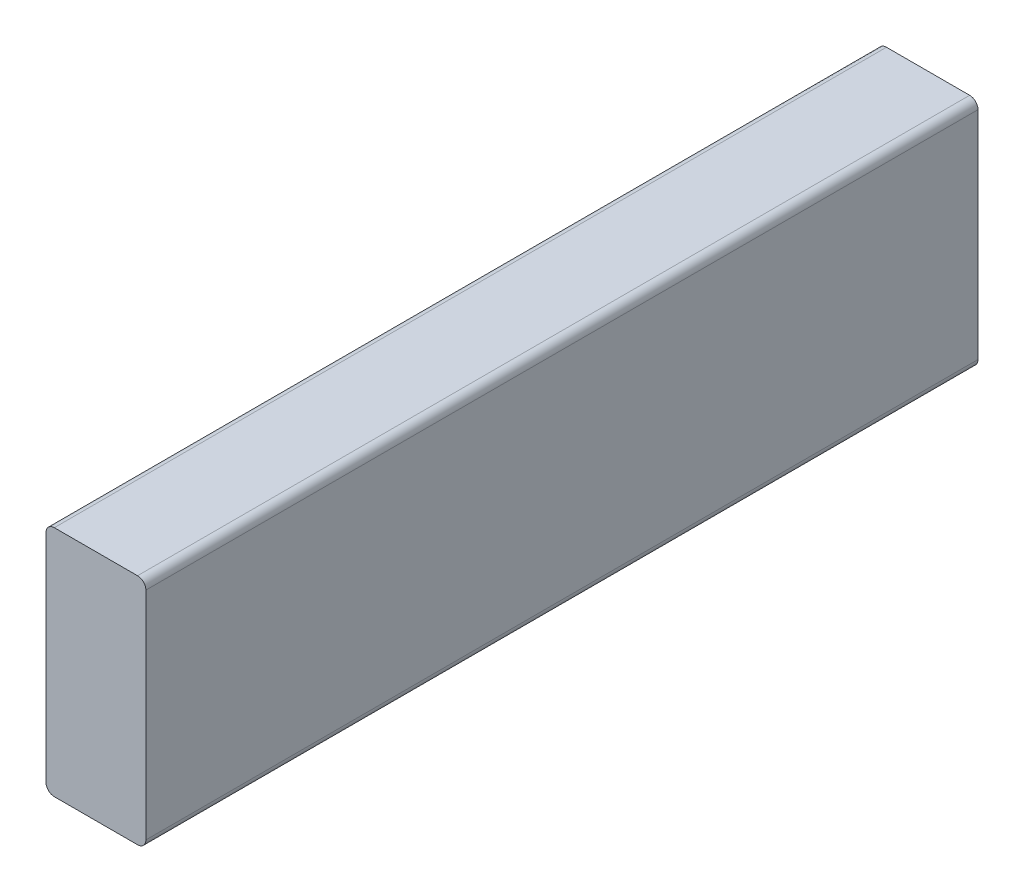
ISO-10303-21;
HEADER;
FILE_DESCRIPTION(('STEP AP214'),'2;1');
FILE_NAME('part.step','',(''),(''),'','','');
FILE_SCHEMA(('AUTOMOTIVE_DESIGN { 1 0 10303 214 1 1 1 1 }'));
ENDSEC;
DATA;
#1=APPLICATION_CONTEXT('core data for automotive mechanical design processes');
#2=APPLICATION_PROTOCOL_DEFINITION('international standard','automotive_design',2000,#1);
#3=PRODUCT_CONTEXT('',#1,'mechanical');
#4=PRODUCT('Part','Part','',(#3));
#5=PRODUCT_RELATED_PRODUCT_CATEGORY('part','',(#4));
#6=PRODUCT_DEFINITION_FORMATION('','',#4);
#7=PRODUCT_DEFINITION_CONTEXT('part definition',#1,'design');
#8=PRODUCT_DEFINITION('design','',#6,#7);
#9=PRODUCT_DEFINITION_SHAPE('','',#8);
#10=(LENGTH_UNIT() NAMED_UNIT(*) SI_UNIT(.MILLI.,.METRE.));
#11=(NAMED_UNIT(*) PLANE_ANGLE_UNIT() SI_UNIT($,.RADIAN.));
#12=(NAMED_UNIT(*) SI_UNIT($,.STERADIAN.) SOLID_ANGLE_UNIT());
#13=UNCERTAINTY_MEASURE_WITH_UNIT(LENGTH_MEASURE(1.E-05),#10,'distance_accuracy_value','');
#14=(GEOMETRIC_REPRESENTATION_CONTEXT(3) GLOBAL_UNCERTAINTY_ASSIGNED_CONTEXT((#13)) GLOBAL_UNIT_ASSIGNED_CONTEXT((#10,
#11,#12)) REPRESENTATION_CONTEXT('',''));
#15=CARTESIAN_POINT('',(0.,0.,0.));
#16=DIRECTION('',(0.,0.,1.));
#17=DIRECTION('',(1.,0.,0.));
#18=AXIS2_PLACEMENT_3D('',#15,#16,#17);
#19=CARTESIAN_POINT('',(19.05,88.9,158.75));
#20=DIRECTION('',(0.,0.,-1.));
#21=DIRECTION('',(-1.,0.,0.));
#22=AXIS2_PLACEMENT_3D('',#19,#20,#21);
#23=PLANE('',#22);
#24=DIRECTION('',(0.,-1.,0.));
#25=VECTOR('',#24,1.);
#26=CARTESIAN_POINT('',(-19.05,88.9,158.75));
#27=LINE('',#26,#25);
#28=CARTESIAN_POINT('',(-19.05,85.725,158.75));
#29=VERTEX_POINT('',#28);
#30=CARTESIAN_POINT('',(-19.05,3.175,158.75));
#31=VERTEX_POINT('',#30);
#32=EDGE_CURVE('E168',#29,#31,#27,.T.);
#33=ORIENTED_EDGE('',*,*,#32,.T.);
#34=CARTESIAN_POINT('',(-15.875,3.175,158.75));
#35=DIRECTION('',(0.,0.,-1.));
#36=DIRECTION('',(-1.,0.,0.));
#37=AXIS2_PLACEMENT_3D('',#34,#35,#36);
#38=CIRCLE('',#37,3.175);
#39=CARTESIAN_POINT('',(-15.875,0.,158.75));
#40=VERTEX_POINT('',#39);
#41=EDGE_CURVE('E142',#31,#40,#38,.F.);
#42=ORIENTED_EDGE('',*,*,#41,.T.);
#43=DIRECTION('',(-1.,0.,0.));
#44=VECTOR('',#43,1.);
#45=CARTESIAN_POINT('',(19.05,0.,158.75));
#46=LINE('',#45,#44);
#47=CARTESIAN_POINT('',(15.875,0.,158.75));
#48=VERTEX_POINT('',#47);
#49=EDGE_CURVE('E121',#48,#40,#46,.T.);
#50=ORIENTED_EDGE('',*,*,#49,.F.);
#51=CARTESIAN_POINT('',(15.875,3.175,158.75));
#52=DIRECTION('',(0.,0.,-1.));
#53=DIRECTION('',(-1.,0.,0.));
#54=AXIS2_PLACEMENT_3D('',#51,#52,#53);
#55=CIRCLE('',#54,3.175);
#56=CARTESIAN_POINT('',(19.05,3.175,158.75));
#57=VERTEX_POINT('',#56);
#58=EDGE_CURVE('E126',#48,#57,#55,.F.);
#59=ORIENTED_EDGE('',*,*,#58,.T.);
#60=DIRECTION('',(0.,-1.,0.));
#61=VECTOR('',#60,1.);
#62=CARTESIAN_POINT('',(19.05,88.9,158.75));
#63=LINE('',#62,#61);
#64=CARTESIAN_POINT('',(19.05,85.725,158.75));
#65=VERTEX_POINT('',#64);
#66=EDGE_CURVE('E163',#65,#57,#63,.T.);
#67=ORIENTED_EDGE('',*,*,#66,.F.);
#68=CARTESIAN_POINT('',(15.875,85.725,158.75));
#69=DIRECTION('',(0.,0.,-1.));
#70=DIRECTION('',(-1.,0.,0.));
#71=AXIS2_PLACEMENT_3D('',#68,#69,#70);
#72=CIRCLE('',#71,3.175);
#73=CARTESIAN_POINT('',(15.875,88.9,158.75));
#74=VERTEX_POINT('',#73);
#75=EDGE_CURVE('E56',#65,#74,#72,.F.);
#76=ORIENTED_EDGE('',*,*,#75,.T.);
#77=DIRECTION('',(-1.,0.,0.));
#78=VECTOR('',#77,1.);
#79=CARTESIAN_POINT('',(19.05,88.9,158.75));
#80=LINE('',#79,#78);
#81=CARTESIAN_POINT('',(-15.875,88.9,158.75));
#82=VERTEX_POINT('',#81);
#83=EDGE_CURVE('E153',#74,#82,#80,.T.);
#84=ORIENTED_EDGE('',*,*,#83,.T.);
#85=CARTESIAN_POINT('',(-15.875,85.725,158.75));
#86=DIRECTION('',(0.,0.,-1.));
#87=DIRECTION('',(-1.,0.,0.));
#88=AXIS2_PLACEMENT_3D('',#85,#86,#87);
#89=CIRCLE('',#88,3.175);
#90=EDGE_CURVE('E49',#82,#29,#89,.F.);
#91=ORIENTED_EDGE('',*,*,#90,.T.);
#92=EDGE_LOOP('',(#33,#42,#50,#59,#67,#76,#84,#91));
#93=FACE_BOUND('',#92,.T.);
#94=ADVANCED_FACE('F34',(#93),#23,.F.);
#95=CARTESIAN_POINT('',(19.05,0.,158.75));
#96=DIRECTION('',(0.,1.,0.));
#97=DIRECTION('',(0.,0.,1.));
#98=AXIS2_PLACEMENT_3D('',#95,#96,#97);
#99=PLANE('',#98);
#100=ORIENTED_EDGE('',*,*,#49,.T.);
#101=DIRECTION('',(0.,0.,-1.));
#102=VECTOR('',#101,1.);
#103=CARTESIAN_POINT('',(-15.875,0.,158.75));
#104=LINE('',#103,#102);
#105=CARTESIAN_POINT('',(-15.875,0.,-158.75));
#106=VERTEX_POINT('',#105);
#107=EDGE_CURVE('E120',#40,#106,#104,.T.);
#108=ORIENTED_EDGE('',*,*,#107,.T.);
#109=DIRECTION('',(-1.,0.,0.));
#110=VECTOR('',#109,1.);
#111=CARTESIAN_POINT('',(19.05,0.,-158.75));
#112=LINE('',#111,#110);
#113=CARTESIAN_POINT('',(15.875,0.,-158.75));
#114=VERTEX_POINT('',#113);
#115=EDGE_CURVE('E103',#114,#106,#112,.T.);
#116=ORIENTED_EDGE('',*,*,#115,.F.);
#117=DIRECTION('',(0.,0.,-1.));
#118=VECTOR('',#117,1.);
#119=CARTESIAN_POINT('',(15.875,0.,158.75));
#120=LINE('',#119,#118);
#121=EDGE_CURVE('E117',#114,#48,#120,.F.);
#122=ORIENTED_EDGE('',*,*,#121,.T.);
#123=EDGE_LOOP('',(#100,#108,#116,#122));
#124=FACE_BOUND('',#123,.T.);
#125=ADVANCED_FACE('F116',(#124),#99,.F.);
#126=CARTESIAN_POINT('',(19.05,88.9,-158.75));
#127=DIRECTION('',(0.,0.,1.));
#128=DIRECTION('',(0.,-1.,0.));
#129=AXIS2_PLACEMENT_3D('',#126,#127,#128);
#130=PLANE('',#129);
#131=ORIENTED_EDGE('',*,*,#115,.T.);
#132=CARTESIAN_POINT('',(-15.875,3.17500000000006,-158.75));
#133=DIRECTION('',(0.,0.,1.));
#134=DIRECTION('',(0.,-1.,0.));
#135=AXIS2_PLACEMENT_3D('',#132,#133,#134);
#136=CIRCLE('',#135,3.175);
#137=CARTESIAN_POINT('',(-19.05,3.17500000000005,-158.75));
#138=VERTEX_POINT('',#137);
#139=EDGE_CURVE('E110',#106,#138,#136,.F.);
#140=ORIENTED_EDGE('',*,*,#139,.T.);
#141=DIRECTION('',(0.,1.,0.));
#142=VECTOR('',#141,1.);
#143=CARTESIAN_POINT('',(-19.05,88.9,-158.75));
#144=LINE('',#143,#142);
#145=CARTESIAN_POINT('',(-19.05,85.7250000000001,-158.75));
#146=VERTEX_POINT('',#145);
#147=EDGE_CURVE('E165',#138,#146,#144,.T.);
#148=ORIENTED_EDGE('',*,*,#147,.T.);
#149=CARTESIAN_POINT('',(-15.875,85.7250000000001,-158.75));
#150=DIRECTION('',(0.,0.,1.));
#151=DIRECTION('',(0.,-1.,0.));
#152=AXIS2_PLACEMENT_3D('',#149,#150,#151);
#153=CIRCLE('',#152,3.175);
#154=CARTESIAN_POINT('',(-15.875,88.9,-158.75));
#155=VERTEX_POINT('',#154);
#156=EDGE_CURVE('E111',#146,#155,#153,.F.);
#157=ORIENTED_EDGE('',*,*,#156,.T.);
#158=DIRECTION('',(-1.,0.,0.));
#159=VECTOR('',#158,1.);
#160=CARTESIAN_POINT('',(19.05,88.9,-158.75));
#161=LINE('',#160,#159);
#162=CARTESIAN_POINT('',(15.875,88.9,-158.75));
#163=VERTEX_POINT('',#162);
#164=EDGE_CURVE('E122',#163,#155,#161,.T.);
#165=ORIENTED_EDGE('',*,*,#164,.F.);
#166=CARTESIAN_POINT('',(15.875,85.7250000000001,-158.75));
#167=DIRECTION('',(0.,0.,1.));
#168=DIRECTION('',(0.,-1.,0.));
#169=AXIS2_PLACEMENT_3D('',#166,#167,#168);
#170=CIRCLE('',#169,3.175);
#171=CARTESIAN_POINT('',(19.05,85.7250000000001,-158.75));
#172=VERTEX_POINT('',#171);
#173=EDGE_CURVE('E128',#163,#172,#170,.F.);
#174=ORIENTED_EDGE('',*,*,#173,.T.);
#175=DIRECTION('',(0.,1.,0.));
#176=VECTOR('',#175,1.);
#177=CARTESIAN_POINT('',(19.05,88.9,-158.75));
#178=LINE('',#177,#176);
#179=CARTESIAN_POINT('',(19.05,3.17500000000005,-158.75));
#180=VERTEX_POINT('',#179);
#181=EDGE_CURVE('E105',#180,#172,#178,.T.);
#182=ORIENTED_EDGE('',*,*,#181,.F.);
#183=CARTESIAN_POINT('',(15.875,3.17500000000006,-158.75));
#184=DIRECTION('',(0.,0.,1.));
#185=DIRECTION('',(0.,-1.,0.));
#186=AXIS2_PLACEMENT_3D('',#183,#184,#185);
#187=CIRCLE('',#186,3.175);
#188=EDGE_CURVE('E100',#180,#114,#187,.F.);
#189=ORIENTED_EDGE('',*,*,#188,.T.);
#190=EDGE_LOOP('',(#131,#140,#148,#157,#165,#174,#182,#189));
#191=FACE_BOUND('',#190,.T.);
#192=ADVANCED_FACE('F102',(#191),#130,.F.);
#193=CARTESIAN_POINT('',(19.05,88.9,158.75));
#194=DIRECTION('',(0.,-1.,0.));
#195=DIRECTION('',(0.,0.,-1.));
#196=AXIS2_PLACEMENT_3D('',#193,#194,#195);
#197=PLANE('',#196);
#198=ORIENTED_EDGE('',*,*,#164,.T.);
#199=DIRECTION('',(0.,0.,1.));
#200=VECTOR('',#199,1.);
#201=CARTESIAN_POINT('',(-15.875,88.9,158.75));
#202=LINE('',#201,#200);
#203=EDGE_CURVE('E11',#155,#82,#202,.T.);
#204=ORIENTED_EDGE('',*,*,#203,.T.);
#205=ORIENTED_EDGE('',*,*,#83,.F.);
#206=DIRECTION('',(0.,0.,1.));
#207=VECTOR('',#206,1.);
#208=CARTESIAN_POINT('',(15.875,88.9,-158.75));
#209=LINE('',#208,#207);
#210=EDGE_CURVE('E42',#74,#163,#209,.F.);
#211=ORIENTED_EDGE('',*,*,#210,.T.);
#212=EDGE_LOOP('',(#198,#204,#205,#211));
#213=FACE_BOUND('',#212,.T.);
#214=ADVANCED_FACE('F152',(#213),#197,.F.);
#215=CARTESIAN_POINT('',(19.05,0.,0.));
#216=DIRECTION('',(1.,0.,0.));
#217=DIRECTION('',(0.,0.,-1.));
#218=AXIS2_PLACEMENT_3D('',#215,#216,#217);
#219=PLANE('',#218);
#220=ORIENTED_EDGE('',*,*,#66,.T.);
#221=DIRECTION('',(0.,0.,-1.));
#222=VECTOR('',#221,1.);
#223=CARTESIAN_POINT('',(19.05,3.17500000000006,-158.75));
#224=LINE('',#223,#222);
#225=EDGE_CURVE('E147',#57,#180,#224,.T.);
#226=ORIENTED_EDGE('',*,*,#225,.T.);
#227=ORIENTED_EDGE('',*,*,#181,.T.);
#228=DIRECTION('',(0.,0.,1.));
#229=VECTOR('',#228,1.);
#230=CARTESIAN_POINT('',(19.05,85.725,158.75));
#231=LINE('',#230,#229);
#232=EDGE_CURVE('E144',#172,#65,#231,.T.);
#233=ORIENTED_EDGE('',*,*,#232,.T.);
#234=EDGE_LOOP('',(#220,#226,#227,#233));
#235=FACE_BOUND('',#234,.T.);
#236=ADVANCED_FACE('F162',(#235),#219,.T.);
#237=CARTESIAN_POINT('',(-19.05,0.,0.));
#238=DIRECTION('',(1.,0.,0.));
#239=DIRECTION('',(0.,0.,-1.));
#240=AXIS2_PLACEMENT_3D('',#237,#238,#239);
#241=PLANE('',#240);
#242=ORIENTED_EDGE('',*,*,#147,.F.);
#243=DIRECTION('',(0.,0.,-1.));
#244=VECTOR('',#243,1.);
#245=CARTESIAN_POINT('',(-19.05,3.17500000000003,0.));
#246=LINE('',#245,#244);
#247=EDGE_CURVE('E137',#138,#31,#246,.F.);
#248=ORIENTED_EDGE('',*,*,#247,.T.);
#249=ORIENTED_EDGE('',*,*,#32,.F.);
#250=DIRECTION('',(0.,0.,1.));
#251=VECTOR('',#250,1.);
#252=CARTESIAN_POINT('',(-19.05,85.725,0.));
#253=LINE('',#252,#251);
#254=EDGE_CURVE('E135',#29,#146,#253,.F.);
#255=ORIENTED_EDGE('',*,*,#254,.T.);
#256=EDGE_LOOP('',(#242,#248,#249,#255));
#257=FACE_BOUND('',#256,.T.);
#258=ADVANCED_FACE('F176',(#257),#241,.F.);
#259=CARTESIAN_POINT('',(-15.875,3.175,158.75));
#260=DIRECTION('',(0.,0.,-1.));
#261=DIRECTION('',(0.,1.,0.));
#262=AXIS2_PLACEMENT_3D('',#259,#260,#261);
#263=CYLINDRICAL_SURFACE('',#262,3.175);
#264=ORIENTED_EDGE('',*,*,#41,.F.);
#265=ORIENTED_EDGE('',*,*,#247,.F.);
#266=ORIENTED_EDGE('',*,*,#139,.F.);
#267=ORIENTED_EDGE('',*,*,#107,.F.);
#268=EDGE_LOOP('',(#264,#265,#266,#267));
#269=FACE_BOUND('',#268,.T.);
#270=ADVANCED_FACE('F184',(#269),#263,.T.);
#271=CARTESIAN_POINT('',(15.875,3.17500000000003,0.));
#272=DIRECTION('',(0.,0.,1.));
#273=DIRECTION('',(0.,-1.,0.));
#274=AXIS2_PLACEMENT_3D('',#271,#272,#273);
#275=CYLINDRICAL_SURFACE('',#274,3.175);
#276=ORIENTED_EDGE('',*,*,#58,.F.);
#277=ORIENTED_EDGE('',*,*,#121,.F.);
#278=ORIENTED_EDGE('',*,*,#188,.F.);
#279=ORIENTED_EDGE('',*,*,#225,.F.);
#280=EDGE_LOOP('',(#276,#277,#278,#279));
#281=FACE_BOUND('',#280,.T.);
#282=ADVANCED_FACE('F125',(#281),#275,.T.);
#283=CARTESIAN_POINT('',(-15.875,85.725,158.75));
#284=DIRECTION('',(0.,0.,1.));
#285=DIRECTION('',(0.,-1.,0.));
#286=AXIS2_PLACEMENT_3D('',#283,#284,#285);
#287=CYLINDRICAL_SURFACE('',#286,3.175);
#288=ORIENTED_EDGE('',*,*,#156,.F.);
#289=ORIENTED_EDGE('',*,*,#254,.F.);
#290=ORIENTED_EDGE('',*,*,#90,.F.);
#291=ORIENTED_EDGE('',*,*,#203,.F.);
#292=EDGE_LOOP('',(#288,#289,#290,#291));
#293=FACE_BOUND('',#292,.T.);
#294=ADVANCED_FACE('F178',(#293),#287,.T.);
#295=CARTESIAN_POINT('',(15.875,85.725,0.));
#296=DIRECTION('',(0.,0.,-1.));
#297=DIRECTION('',(0.,1.,0.));
#298=AXIS2_PLACEMENT_3D('',#295,#296,#297);
#299=CYLINDRICAL_SURFACE('',#298,3.175);
#300=ORIENTED_EDGE('',*,*,#173,.F.);
#301=ORIENTED_EDGE('',*,*,#210,.F.);
#302=ORIENTED_EDGE('',*,*,#75,.F.);
#303=ORIENTED_EDGE('',*,*,#232,.F.);
#304=EDGE_LOOP('',(#300,#301,#302,#303));
#305=FACE_BOUND('',#304,.T.);
#306=ADVANCED_FACE('F36',(#305),#299,.T.);
#307=CLOSED_SHELL('',(#94,#125,#192,#214,#236,#258,#270,#282,#294,#306));
#308=MANIFOLD_SOLID_BREP('B2',#307);
#309=ADVANCED_BREP_SHAPE_REPRESENTATION('',(#18,#308),#14);
#310=SHAPE_DEFINITION_REPRESENTATION(#9,#309);
ENDSEC;
END-ISO-10303-21;
